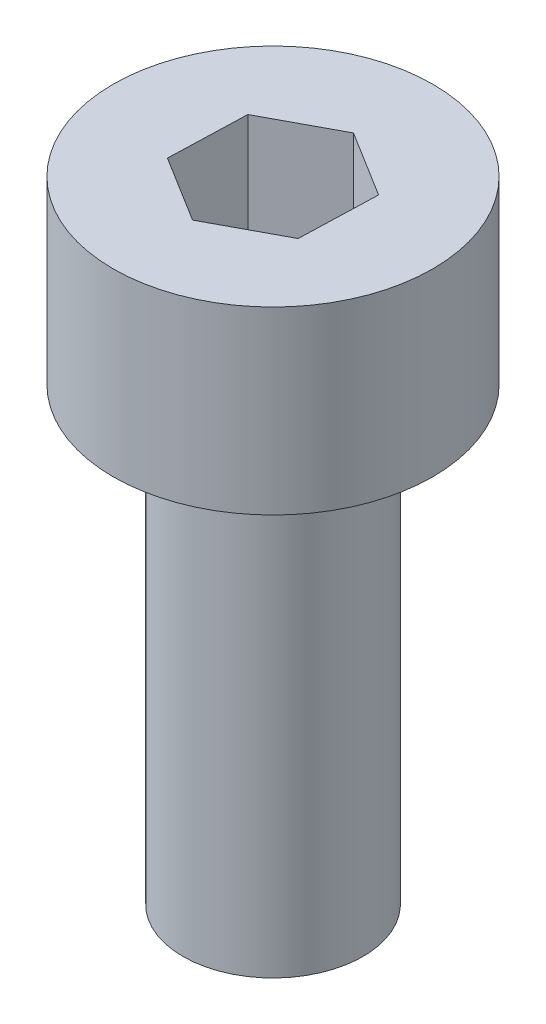
ISO-10303-21;
HEADER;
FILE_DESCRIPTION(('STEP AP214'),'2;1');
FILE_NAME('part.step','',(''),(''),'','','');
FILE_SCHEMA(('AUTOMOTIVE_DESIGN { 1 0 10303 214 1 1 1 1 }'));
ENDSEC;
DATA;
#1=APPLICATION_CONTEXT('core data for automotive mechanical design processes');
#2=APPLICATION_PROTOCOL_DEFINITION('international standard','automotive_design',2000,#1);
#3=PRODUCT_CONTEXT('',#1,'mechanical');
#4=PRODUCT('Part','Part','',(#3));
#5=PRODUCT_RELATED_PRODUCT_CATEGORY('part','',(#4));
#6=PRODUCT_DEFINITION_FORMATION('','',#4);
#7=PRODUCT_DEFINITION_CONTEXT('part definition',#1,'design');
#8=PRODUCT_DEFINITION('design','',#6,#7);
#9=PRODUCT_DEFINITION_SHAPE('','',#8);
#10=(LENGTH_UNIT() NAMED_UNIT(*) SI_UNIT(.MILLI.,.METRE.));
#11=(NAMED_UNIT(*) PLANE_ANGLE_UNIT() SI_UNIT($,.RADIAN.));
#12=(NAMED_UNIT(*) SI_UNIT($,.STERADIAN.) SOLID_ANGLE_UNIT());
#13=UNCERTAINTY_MEASURE_WITH_UNIT(LENGTH_MEASURE(1.E-05),#10,'distance_accuracy_value','');
#14=(GEOMETRIC_REPRESENTATION_CONTEXT(3) GLOBAL_UNCERTAINTY_ASSIGNED_CONTEXT((#13)) GLOBAL_UNIT_ASSIGNED_CONTEXT((#10,
#11,#12)) REPRESENTATION_CONTEXT('',''));
#15=CARTESIAN_POINT('',(0.,0.,0.));
#16=DIRECTION('',(0.,0.,1.));
#17=DIRECTION('',(1.,0.,0.));
#18=AXIS2_PLACEMENT_3D('',#15,#16,#17);
#19=CARTESIAN_POINT('',(0.,4.,0.));
#20=DIRECTION('',(0.,-1.,0.));
#21=DIRECTION('',(0.,0.,-1.));
#22=AXIS2_PLACEMENT_3D('',#19,#20,#21);
#23=CYLINDRICAL_SURFACE('',#22,3.55);
#24=CARTESIAN_POINT('',(0.,4.,0.));
#25=DIRECTION('',(0.,1.,0.));
#26=DIRECTION('',(0.,0.,1.));
#27=AXIS2_PLACEMENT_3D('',#24,#25,#26);
#28=CIRCLE('',#27,3.55);
#29=CARTESIAN_POINT('',(0.,4.,3.55));
#30=VERTEX_POINT('',#29);
#31=EDGE_CURVE('E44',#30,#30,#28,.T.);
#32=ORIENTED_EDGE('',*,*,#31,.F.);
#33=EDGE_LOOP('',(#32));
#34=FACE_BOUND('',#33,.T.);
#35=CARTESIAN_POINT('',(0.,0.,0.));
#36=DIRECTION('',(0.,1.,0.));
#37=DIRECTION('',(0.,0.,1.));
#38=AXIS2_PLACEMENT_3D('',#35,#36,#37);
#39=CIRCLE('',#38,3.55);
#40=CARTESIAN_POINT('',(0.,0.,3.55));
#41=VERTEX_POINT('',#40);
#42=EDGE_CURVE('E39',#41,#41,#39,.T.);
#43=ORIENTED_EDGE('',*,*,#42,.T.);
#44=EDGE_LOOP('',(#43));
#45=FACE_BOUND('',#44,.T.);
#46=ADVANCED_FACE('F36',(#34,#45),#23,.T.);
#47=CARTESIAN_POINT('',(0.,4.,0.));
#48=DIRECTION('',(0.,1.,0.));
#49=DIRECTION('',(0.,0.,1.));
#50=AXIS2_PLACEMENT_3D('',#47,#48,#49);
#51=PLANE('',#50);
#52=DIRECTION('',(-0.849665122348572,0.,-0.527322652523468));
#53=VECTOR('',#52,1.);
#54=CARTESIAN_POINT('',(1.52681555944868,4.,-0.817822870446541));
#55=LINE('',#54,#53);
#56=CARTESIAN_POINT('',(1.52681555944868,4.,-0.817822870446541));
#57=VERTEX_POINT('',#56);
#58=CARTESIAN_POINT('',(0.0551523981217248,4.,-1.73117249659918));
#59=VERTEX_POINT('',#58);
#60=EDGE_CURVE('E52',#57,#59,#55,.T.);
#61=ORIENTED_EDGE('',*,*,#60,.F.);
#62=DIRECTION('',(0.031842251902031,0.,-0.999492906925211));
#63=VECTOR('',#62,1.);
#64=CARTESIAN_POINT('',(1.47166316132695,4.,0.913349626152634));
#65=LINE('',#64,#63);
#66=CARTESIAN_POINT('',(1.47166316132695,4.,0.913349626152634));
#67=VERTEX_POINT('',#66);
#68=EDGE_CURVE('E135',#67,#57,#65,.T.);
#69=ORIENTED_EDGE('',*,*,#68,.F.);
#70=DIRECTION('',(0.881507374250603,0.,-0.472170254401743));
#71=VECTOR('',#70,1.);
#72=CARTESIAN_POINT('',(-0.0551523981217241,4.,1.73117249659918));
#73=LINE('',#72,#71);
#74=CARTESIAN_POINT('',(-0.0551523981217241,4.,1.73117249659918));
#75=VERTEX_POINT('',#74);
#76=EDGE_CURVE('E133',#75,#67,#73,.T.);
#77=ORIENTED_EDGE('',*,*,#76,.F.);
#78=DIRECTION('',(0.849665122348572,0.,0.527322652523467));
#79=VECTOR('',#78,1.);
#80=CARTESIAN_POINT('',(-1.52681555944868,4.,0.817822870446541));
#81=LINE('',#80,#79);
#82=CARTESIAN_POINT('',(-1.52681555944868,4.,0.817822870446541));
#83=VERTEX_POINT('',#82);
#84=EDGE_CURVE('E100',#83,#75,#81,.T.);
#85=ORIENTED_EDGE('',*,*,#84,.F.);
#86=DIRECTION('',(-0.0318422519020308,0.,0.999492906925211));
#87=VECTOR('',#86,1.);
#88=CARTESIAN_POINT('',(-1.47166316132695,4.,-0.913349626152635));
#89=LINE('',#88,#87);
#90=CARTESIAN_POINT('',(-1.47166316132695,4.,-0.913349626152635));
#91=VERTEX_POINT('',#90);
#92=EDGE_CURVE('E129',#91,#83,#89,.T.);
#93=ORIENTED_EDGE('',*,*,#92,.F.);
#94=DIRECTION('',(-0.881507374250603,0.,0.472170254401743));
#95=VECTOR('',#94,1.);
#96=CARTESIAN_POINT('',(0.0551523981217247,4.,-1.73117249659918));
#97=LINE('',#96,#95);
#98=EDGE_CURVE('E126',#59,#91,#97,.T.);
#99=ORIENTED_EDGE('',*,*,#98,.F.);
#100=EDGE_LOOP('',(#61,#69,#77,#85,#93,#99));
#101=FACE_BOUND('',#100,.T.);
#102=ORIENTED_EDGE('',*,*,#31,.T.);
#103=EDGE_LOOP('',(#102));
#104=FACE_BOUND('',#103,.T.);
#105=ADVANCED_FACE('F156',(#101,#104),#51,.T.);
#106=CARTESIAN_POINT('',(0.,0.,0.));
#107=DIRECTION('',(0.,1.,0.));
#108=DIRECTION('',(0.,0.,1.));
#109=AXIS2_PLACEMENT_3D('',#106,#107,#108);
#110=PLANE('',#109);
#111=CARTESIAN_POINT('',(0.,0.,0.));
#112=DIRECTION('',(0.,-1.,0.));
#113=DIRECTION('',(0.,0.,-1.));
#114=AXIS2_PLACEMENT_3D('',#111,#112,#113);
#115=CIRCLE('',#114,2.);
#116=CARTESIAN_POINT('',(0.,0.,-2.));
#117=VERTEX_POINT('',#116);
#118=EDGE_CURVE('E11',#117,#117,#115,.T.);
#119=ORIENTED_EDGE('',*,*,#118,.F.);
#120=EDGE_LOOP('',(#119));
#121=FACE_BOUND('',#120,.T.);
#122=ORIENTED_EDGE('',*,*,#42,.F.);
#123=EDGE_LOOP('',(#122));
#124=FACE_BOUND('',#123,.T.);
#125=ADVANCED_FACE('F153',(#121,#124),#110,.F.);
#126=CARTESIAN_POINT('',(0.,-10.,0.));
#127=DIRECTION('',(0.,1.,0.));
#128=DIRECTION('',(0.,0.,1.));
#129=AXIS2_PLACEMENT_3D('',#126,#127,#128);
#130=CYLINDRICAL_SURFACE('',#129,2.);
#131=CARTESIAN_POINT('',(0.,-10.,0.));
#132=DIRECTION('',(0.,-1.,0.));
#133=DIRECTION('',(0.,0.,-1.));
#134=AXIS2_PLACEMENT_3D('',#131,#132,#133);
#135=CIRCLE('',#134,2.);
#136=CARTESIAN_POINT('',(0.,-10.,-2.));
#137=VERTEX_POINT('',#136);
#138=EDGE_CURVE('E139',#137,#137,#135,.T.);
#139=ORIENTED_EDGE('',*,*,#138,.F.);
#140=EDGE_LOOP('',(#139));
#141=FACE_BOUND('',#140,.T.);
#142=ORIENTED_EDGE('',*,*,#118,.T.);
#143=EDGE_LOOP('',(#142));
#144=FACE_BOUND('',#143,.T.);
#145=ADVANCED_FACE('F155',(#141,#144),#130,.T.);
#146=CARTESIAN_POINT('',(0.,-10.,0.));
#147=DIRECTION('',(0.,-1.,0.));
#148=DIRECTION('',(0.,0.,-1.));
#149=AXIS2_PLACEMENT_3D('',#146,#147,#148);
#150=PLANE('',#149);
#151=ORIENTED_EDGE('',*,*,#138,.T.);
#152=EDGE_LOOP('',(#151));
#153=FACE_BOUND('',#152,.T.);
#154=ADVANCED_FACE('F162',(#153),#150,.T.);
#155=CARTESIAN_POINT('',(1.52681555944868,1.,-0.817822870446541));
#156=DIRECTION('',(0.527322652523468,0.,-0.849665122348572));
#157=DIRECTION('',(-0.849665122348572,0.,-0.527322652523468));
#158=AXIS2_PLACEMENT_3D('',#155,#156,#157);
#159=PLANE('',#158);
#160=ORIENTED_EDGE('',*,*,#60,.T.);
#161=DIRECTION('',(0.,1.,0.));
#162=VECTOR('',#161,1.);
#163=CARTESIAN_POINT('',(0.0551523981217247,1.,-1.73117249659918));
#164=LINE('',#163,#162);
#165=CARTESIAN_POINT('',(0.0551523981217247,1.,-1.73117249659918));
#166=VERTEX_POINT('',#165);
#167=EDGE_CURVE('E82',#166,#59,#164,.T.);
#168=ORIENTED_EDGE('',*,*,#167,.F.);
#169=DIRECTION('',(-0.849665122348572,0.,-0.527322652523468));
#170=VECTOR('',#169,1.);
#171=CARTESIAN_POINT('',(1.52681555944868,1.,-0.817822870446541));
#172=LINE('',#171,#170);
#173=CARTESIAN_POINT('',(1.52681555944868,1.,-0.817822870446541));
#174=VERTEX_POINT('',#173);
#175=EDGE_CURVE('E137',#174,#166,#172,.T.);
#176=ORIENTED_EDGE('',*,*,#175,.F.);
#177=DIRECTION('',(0.,1.,0.));
#178=VECTOR('',#177,1.);
#179=CARTESIAN_POINT('',(1.52681555944868,1.,-0.817822870446541));
#180=LINE('',#179,#178);
#181=EDGE_CURVE('E60',#174,#57,#180,.T.);
#182=ORIENTED_EDGE('',*,*,#181,.T.);
#183=EDGE_LOOP('',(#160,#168,#176,#182));
#184=FACE_BOUND('',#183,.T.);
#185=ADVANCED_FACE('F187',(#184),#159,.F.);
#186=CARTESIAN_POINT('',(1.47166316132695,1.,0.913349626152634));
#187=DIRECTION('',(0.99949290692521,0.,0.031842251902031));
#188=DIRECTION('',(0.031842251902031,0.,-0.999492906925211));
#189=AXIS2_PLACEMENT_3D('',#186,#187,#188);
#190=PLANE('',#189);
#191=ORIENTED_EDGE('',*,*,#68,.T.);
#192=ORIENTED_EDGE('',*,*,#181,.F.);
#193=DIRECTION('',(0.031842251902031,0.,-0.999492906925211));
#194=VECTOR('',#193,1.);
#195=CARTESIAN_POINT('',(1.47166316132695,1.,0.913349626152634));
#196=LINE('',#195,#194);
#197=CARTESIAN_POINT('',(1.47166316132695,1.,0.913349626152634));
#198=VERTEX_POINT('',#197);
#199=EDGE_CURVE('E112',#198,#174,#196,.T.);
#200=ORIENTED_EDGE('',*,*,#199,.F.);
#201=DIRECTION('',(0.,1.,0.));
#202=VECTOR('',#201,1.);
#203=CARTESIAN_POINT('',(1.47166316132695,1.,0.913349626152634));
#204=LINE('',#203,#202);
#205=EDGE_CURVE('E104',#198,#67,#204,.T.);
#206=ORIENTED_EDGE('',*,*,#205,.T.);
#207=EDGE_LOOP('',(#191,#192,#200,#206));
#208=FACE_BOUND('',#207,.T.);
#209=ADVANCED_FACE('F192',(#208),#190,.F.);
#210=CARTESIAN_POINT('',(-0.0551523981217241,1.,1.73117249659918));
#211=DIRECTION('',(0.472170254401743,0.,0.881507374250603));
#212=DIRECTION('',(0.881507374250604,0.,-0.472170254401743));
#213=AXIS2_PLACEMENT_3D('',#210,#211,#212);
#214=PLANE('',#213);
#215=ORIENTED_EDGE('',*,*,#76,.T.);
#216=ORIENTED_EDGE('',*,*,#205,.F.);
#217=DIRECTION('',(0.881507374250603,0.,-0.472170254401743));
#218=VECTOR('',#217,1.);
#219=CARTESIAN_POINT('',(-0.0551523981217241,1.,1.73117249659918));
#220=LINE('',#219,#218);
#221=CARTESIAN_POINT('',(-0.0551523981217241,1.,1.73117249659918));
#222=VERTEX_POINT('',#221);
#223=EDGE_CURVE('E108',#222,#198,#220,.T.);
#224=ORIENTED_EDGE('',*,*,#223,.F.);
#225=DIRECTION('',(0.,1.,0.));
#226=VECTOR('',#225,1.);
#227=CARTESIAN_POINT('',(-0.0551523981217241,1.,1.73117249659918));
#228=LINE('',#227,#226);
#229=EDGE_CURVE('E93',#222,#75,#228,.T.);
#230=ORIENTED_EDGE('',*,*,#229,.T.);
#231=EDGE_LOOP('',(#215,#216,#224,#230));
#232=FACE_BOUND('',#231,.T.);
#233=ADVANCED_FACE('F109',(#232),#214,.F.);
#234=CARTESIAN_POINT('',(-1.52681555944868,1.,0.817822870446541));
#235=DIRECTION('',(-0.527322652523468,0.,0.849665122348572));
#236=DIRECTION('',(0.849665122348572,0.,0.527322652523468));
#237=AXIS2_PLACEMENT_3D('',#234,#235,#236);
#238=PLANE('',#237);
#239=ORIENTED_EDGE('',*,*,#84,.T.);
#240=ORIENTED_EDGE('',*,*,#229,.F.);
#241=DIRECTION('',(0.849665122348572,0.,0.527322652523467));
#242=VECTOR('',#241,1.);
#243=CARTESIAN_POINT('',(-1.52681555944868,1.,0.817822870446541));
#244=LINE('',#243,#242);
#245=CARTESIAN_POINT('',(-1.52681555944868,1.,0.817822870446541));
#246=VERTEX_POINT('',#245);
#247=EDGE_CURVE('E97',#246,#222,#244,.T.);
#248=ORIENTED_EDGE('',*,*,#247,.F.);
#249=DIRECTION('',(0.,1.,0.));
#250=VECTOR('',#249,1.);
#251=CARTESIAN_POINT('',(-1.52681555944868,1.,0.817822870446541));
#252=LINE('',#251,#250);
#253=EDGE_CURVE('E105',#246,#83,#252,.T.);
#254=ORIENTED_EDGE('',*,*,#253,.T.);
#255=EDGE_LOOP('',(#239,#240,#248,#254));
#256=FACE_BOUND('',#255,.T.);
#257=ADVANCED_FACE('F95',(#256),#238,.F.);
#258=CARTESIAN_POINT('',(-1.47166316132695,1.,-0.913349626152635));
#259=DIRECTION('',(-0.999492906925211,0.,-0.0318422519020308));
#260=DIRECTION('',(-0.0318422519020308,0.,0.999492906925211));
#261=AXIS2_PLACEMENT_3D('',#258,#259,#260);
#262=PLANE('',#261);
#263=ORIENTED_EDGE('',*,*,#92,.T.);
#264=ORIENTED_EDGE('',*,*,#253,.F.);
#265=DIRECTION('',(-0.0318422519020308,0.,0.999492906925211));
#266=VECTOR('',#265,1.);
#267=CARTESIAN_POINT('',(-1.47166316132695,1.,-0.913349626152635));
#268=LINE('',#267,#266);
#269=CARTESIAN_POINT('',(-1.47166316132695,1.,-0.913349626152635));
#270=VERTEX_POINT('',#269);
#271=EDGE_CURVE('E118',#270,#246,#268,.T.);
#272=ORIENTED_EDGE('',*,*,#271,.F.);
#273=DIRECTION('',(0.,1.,0.));
#274=VECTOR('',#273,1.);
#275=CARTESIAN_POINT('',(-1.47166316132695,1.,-0.913349626152635));
#276=LINE('',#275,#274);
#277=EDGE_CURVE('E142',#270,#91,#276,.T.);
#278=ORIENTED_EDGE('',*,*,#277,.T.);
#279=EDGE_LOOP('',(#263,#264,#272,#278));
#280=FACE_BOUND('',#279,.T.);
#281=ADVANCED_FACE('F217',(#280),#262,.F.);
#282=CARTESIAN_POINT('',(0.0551523981217247,1.,-1.73117249659918));
#283=DIRECTION('',(-0.472170254401743,0.,-0.881507374250603));
#284=DIRECTION('',(-0.881507374250603,0.,0.472170254401743));
#285=AXIS2_PLACEMENT_3D('',#282,#283,#284);
#286=PLANE('',#285);
#287=ORIENTED_EDGE('',*,*,#98,.T.);
#288=ORIENTED_EDGE('',*,*,#277,.F.);
#289=DIRECTION('',(-0.881507374250603,0.,0.472170254401743));
#290=VECTOR('',#289,1.);
#291=CARTESIAN_POINT('',(0.0551523981217247,1.,-1.73117249659918));
#292=LINE('',#291,#290);
#293=EDGE_CURVE('E120',#166,#270,#292,.T.);
#294=ORIENTED_EDGE('',*,*,#293,.F.);
#295=ORIENTED_EDGE('',*,*,#167,.T.);
#296=EDGE_LOOP('',(#287,#288,#294,#295));
#297=FACE_BOUND('',#296,.T.);
#298=ADVANCED_FACE('F226',(#297),#286,.F.);
#299=CARTESIAN_POINT('',(0.,1.,0.));
#300=DIRECTION('',(0.,1.,0.));
#301=DIRECTION('',(0.,0.,1.));
#302=AXIS2_PLACEMENT_3D('',#299,#300,#301);
#303=PLANE('',#302);
#304=ORIENTED_EDGE('',*,*,#175,.T.);
#305=ORIENTED_EDGE('',*,*,#293,.T.);
#306=ORIENTED_EDGE('',*,*,#271,.T.);
#307=ORIENTED_EDGE('',*,*,#247,.T.);
#308=ORIENTED_EDGE('',*,*,#223,.T.);
#309=ORIENTED_EDGE('',*,*,#199,.T.);
#310=EDGE_LOOP('',(#304,#305,#306,#307,#308,#309));
#311=FACE_BOUND('',#310,.T.);
#312=ADVANCED_FACE('F115',(#311),#303,.T.);
#313=CLOSED_SHELL('',(#46,#105,#125,#145,#154,#185,#209,#233,#257,#281,#298,#312));
#314=MANIFOLD_SOLID_BREP('B2',#313);
#315=ADVANCED_BREP_SHAPE_REPRESENTATION('',(#18,#314),#14);
#316=SHAPE_DEFINITION_REPRESENTATION(#9,#315);
ENDSEC;
END-ISO-10303-21;
